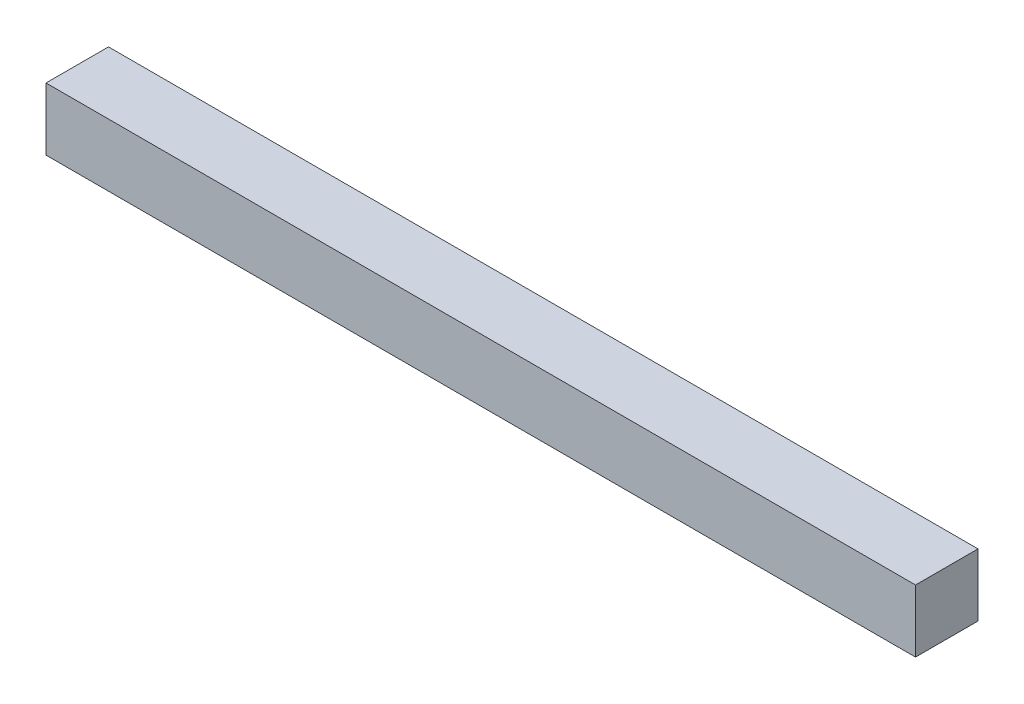
ISO-10303-21;
HEADER;
FILE_DESCRIPTION(('STEP AP214'),'2;1');
FILE_NAME('part.step','',(''),(''),'','','');
FILE_SCHEMA(('AUTOMOTIVE_DESIGN { 1 0 10303 214 1 1 1 1 }'));
ENDSEC;
DATA;
#1=APPLICATION_CONTEXT('core data for automotive mechanical design processes');
#2=APPLICATION_PROTOCOL_DEFINITION('international standard','automotive_design',2000,#1);
#3=PRODUCT_CONTEXT('',#1,'mechanical');
#4=PRODUCT('Part','Part','',(#3));
#5=PRODUCT_RELATED_PRODUCT_CATEGORY('part','',(#4));
#6=PRODUCT_DEFINITION_FORMATION('','',#4);
#7=PRODUCT_DEFINITION_CONTEXT('part definition',#1,'design');
#8=PRODUCT_DEFINITION('design','',#6,#7);
#9=PRODUCT_DEFINITION_SHAPE('','',#8);
#10=(LENGTH_UNIT() NAMED_UNIT(*) SI_UNIT(.MILLI.,.METRE.));
#11=(NAMED_UNIT(*) PLANE_ANGLE_UNIT() SI_UNIT($,.RADIAN.));
#12=(NAMED_UNIT(*) SI_UNIT($,.STERADIAN.) SOLID_ANGLE_UNIT());
#13=UNCERTAINTY_MEASURE_WITH_UNIT(LENGTH_MEASURE(1.E-05),#10,'distance_accuracy_value','');
#14=(GEOMETRIC_REPRESENTATION_CONTEXT(3) GLOBAL_UNCERTAINTY_ASSIGNED_CONTEXT((#13)) GLOBAL_UNIT_ASSIGNED_CONTEXT((#10,
#11,#12)) REPRESENTATION_CONTEXT('',''));
#15=CARTESIAN_POINT('',(0.,0.,0.));
#16=DIRECTION('',(0.,0.,1.));
#17=DIRECTION('',(1.,0.,0.));
#18=AXIS2_PLACEMENT_3D('',#15,#16,#17);
#19=CARTESIAN_POINT('',(320.,12.2375655490227,-5.62450341649455));
#20=DIRECTION('',(0.,0.,1.));
#21=DIRECTION('',(0.,-1.,0.));
#22=AXIS2_PLACEMENT_3D('',#19,#20,#21);
#23=PLANE('',#22);
#24=DIRECTION('',(0.,1.,0.));
#25=VECTOR('',#24,1.);
#26=CARTESIAN_POINT('',(0.,12.2375655490227,-5.62450341649455));
#27=LINE('',#26,#25);
#28=CARTESIAN_POINT('',(0.,-10.7624344509773,-5.62450341649455));
#29=VERTEX_POINT('',#28);
#30=CARTESIAN_POINT('',(0.,12.2375655490227,-5.62450341649455));
#31=VERTEX_POINT('',#30);
#32=EDGE_CURVE('E98',#29,#31,#27,.T.);
#33=ORIENTED_EDGE('',*,*,#32,.T.);
#34=DIRECTION('',(-1.,0.,0.));
#35=VECTOR('',#34,1.);
#36=CARTESIAN_POINT('',(320.,12.2375655490227,-5.62450341649455));
#37=LINE('',#36,#35);
#38=CARTESIAN_POINT('',(320.,12.2375655490227,-5.62450341649455));
#39=VERTEX_POINT('',#38);
#40=EDGE_CURVE('E11',#39,#31,#37,.T.);
#41=ORIENTED_EDGE('',*,*,#40,.F.);
#42=DIRECTION('',(0.,1.,0.));
#43=VECTOR('',#42,1.);
#44=CARTESIAN_POINT('',(320.,12.2375655490227,-5.62450341649455));
#45=LINE('',#44,#43);
#46=CARTESIAN_POINT('',(320.,-10.7624344509773,-5.62450341649455));
#47=VERTEX_POINT('',#46);
#48=EDGE_CURVE('E86',#47,#39,#45,.T.);
#49=ORIENTED_EDGE('',*,*,#48,.F.);
#50=DIRECTION('',(-1.,0.,0.));
#51=VECTOR('',#50,1.);
#52=CARTESIAN_POINT('',(320.,-10.7624344509773,-5.62450341649455));
#53=LINE('',#52,#51);
#54=EDGE_CURVE('E94',#47,#29,#53,.T.);
#55=ORIENTED_EDGE('',*,*,#54,.T.);
#56=EDGE_LOOP('',(#33,#41,#49,#55));
#57=FACE_BOUND('',#56,.T.);
#58=ADVANCED_FACE('F35',(#57),#23,.F.);
#59=CARTESIAN_POINT('',(320.,12.2375655490227,-5.62450341649455));
#60=DIRECTION('',(0.,-1.,0.));
#61=DIRECTION('',(0.,0.,-1.));
#62=AXIS2_PLACEMENT_3D('',#59,#60,#61);
#63=PLANE('',#62);
#64=DIRECTION('',(0.,0.,1.));
#65=VECTOR('',#64,1.);
#66=CARTESIAN_POINT('',(0.,12.2375655490227,-5.62450341649455));
#67=LINE('',#66,#65);
#68=CARTESIAN_POINT('',(0.,12.2375655490227,17.3754965835055));
#69=VERTEX_POINT('',#68);
#70=EDGE_CURVE('E90',#31,#69,#67,.T.);
#71=ORIENTED_EDGE('',*,*,#70,.T.);
#72=DIRECTION('',(-1.,0.,0.));
#73=VECTOR('',#72,1.);
#74=CARTESIAN_POINT('',(320.,12.2375655490227,17.3754965835055));
#75=LINE('',#74,#73);
#76=CARTESIAN_POINT('',(320.,12.2375655490227,17.3754965835055));
#77=VERTEX_POINT('',#76);
#78=EDGE_CURVE('E43',#77,#69,#75,.T.);
#79=ORIENTED_EDGE('',*,*,#78,.F.);
#80=DIRECTION('',(0.,0.,1.));
#81=VECTOR('',#80,1.);
#82=CARTESIAN_POINT('',(320.,12.2375655490227,-5.62450341649455));
#83=LINE('',#82,#81);
#84=EDGE_CURVE('E81',#39,#77,#83,.T.);
#85=ORIENTED_EDGE('',*,*,#84,.F.);
#86=ORIENTED_EDGE('',*,*,#40,.T.);
#87=EDGE_LOOP('',(#71,#79,#85,#86));
#88=FACE_BOUND('',#87,.T.);
#89=ADVANCED_FACE('F89',(#88),#63,.F.);
#90=CARTESIAN_POINT('',(320.,12.2375655490227,17.3754965835055));
#91=DIRECTION('',(0.,0.,-1.));
#92=DIRECTION('',(-1.,0.,0.));
#93=AXIS2_PLACEMENT_3D('',#90,#91,#92);
#94=PLANE('',#93);
#95=DIRECTION('',(0.,-1.,0.));
#96=VECTOR('',#95,1.);
#97=CARTESIAN_POINT('',(0.,12.2375655490227,17.3754965835055));
#98=LINE('',#97,#96);
#99=CARTESIAN_POINT('',(0.,-10.7624344509773,17.3754965835055));
#100=VERTEX_POINT('',#99);
#101=EDGE_CURVE('E68',#69,#100,#98,.T.);
#102=ORIENTED_EDGE('',*,*,#101,.T.);
#103=DIRECTION('',(-1.,0.,0.));
#104=VECTOR('',#103,1.);
#105=CARTESIAN_POINT('',(320.,-10.7624344509773,17.3754965835055));
#106=LINE('',#105,#104);
#107=CARTESIAN_POINT('',(320.,-10.7624344509773,17.3754965835055));
#108=VERTEX_POINT('',#107);
#109=EDGE_CURVE('E91',#108,#100,#106,.T.);
#110=ORIENTED_EDGE('',*,*,#109,.F.);
#111=DIRECTION('',(0.,-1.,0.));
#112=VECTOR('',#111,1.);
#113=CARTESIAN_POINT('',(320.,12.2375655490227,17.3754965835055));
#114=LINE('',#113,#112);
#115=EDGE_CURVE('E84',#77,#108,#114,.T.);
#116=ORIENTED_EDGE('',*,*,#115,.F.);
#117=ORIENTED_EDGE('',*,*,#78,.T.);
#118=EDGE_LOOP('',(#102,#110,#116,#117));
#119=FACE_BOUND('',#118,.T.);
#120=ADVANCED_FACE('F92',(#119),#94,.F.);
#121=CARTESIAN_POINT('',(320.,-10.7624344509773,-5.62450341649455));
#122=DIRECTION('',(0.,1.,0.));
#123=DIRECTION('',(0.,0.,1.));
#124=AXIS2_PLACEMENT_3D('',#121,#122,#123);
#125=PLANE('',#124);
#126=DIRECTION('',(0.,0.,-1.));
#127=VECTOR('',#126,1.);
#128=CARTESIAN_POINT('',(0.,-10.7624344509773,-5.62450341649455));
#129=LINE('',#128,#127);
#130=EDGE_CURVE('E74',#100,#29,#129,.T.);
#131=ORIENTED_EDGE('',*,*,#130,.T.);
#132=ORIENTED_EDGE('',*,*,#54,.F.);
#133=DIRECTION('',(0.,0.,-1.));
#134=VECTOR('',#133,1.);
#135=CARTESIAN_POINT('',(320.,-10.7624344509773,-5.62450341649455));
#136=LINE('',#135,#134);
#137=EDGE_CURVE('E51',#108,#47,#136,.T.);
#138=ORIENTED_EDGE('',*,*,#137,.F.);
#139=ORIENTED_EDGE('',*,*,#109,.T.);
#140=EDGE_LOOP('',(#131,#132,#138,#139));
#141=FACE_BOUND('',#140,.T.);
#142=ADVANCED_FACE('F105',(#141),#125,.F.);
#143=CARTESIAN_POINT('',(320.,0.,0.));
#144=DIRECTION('',(-1.,0.,0.));
#145=DIRECTION('',(0.,0.,1.));
#146=AXIS2_PLACEMENT_3D('',#143,#144,#145);
#147=PLANE('',#146);
#148=ORIENTED_EDGE('',*,*,#48,.T.);
#149=ORIENTED_EDGE('',*,*,#84,.T.);
#150=ORIENTED_EDGE('',*,*,#115,.T.);
#151=ORIENTED_EDGE('',*,*,#137,.T.);
#152=EDGE_LOOP('',(#148,#149,#150,#151));
#153=FACE_BOUND('',#152,.T.);
#154=ADVANCED_FACE('F82',(#153),#147,.F.);
#155=CARTESIAN_POINT('',(0.,0.,0.));
#156=DIRECTION('',(-1.,0.,0.));
#157=DIRECTION('',(0.,0.,1.));
#158=AXIS2_PLACEMENT_3D('',#155,#156,#157);
#159=PLANE('',#158);
#160=ORIENTED_EDGE('',*,*,#32,.F.);
#161=ORIENTED_EDGE('',*,*,#130,.F.);
#162=ORIENTED_EDGE('',*,*,#101,.F.);
#163=ORIENTED_EDGE('',*,*,#70,.F.);
#164=EDGE_LOOP('',(#160,#161,#162,#163));
#165=FACE_BOUND('',#164,.T.);
#166=ADVANCED_FACE('F108',(#165),#159,.T.);
#167=CLOSED_SHELL('',(#58,#89,#120,#142,#154,#166));
#168=MANIFOLD_SOLID_BREP('B2',#167);
#169=ADVANCED_BREP_SHAPE_REPRESENTATION('',(#18,#168),#14);
#170=SHAPE_DEFINITION_REPRESENTATION(#9,#169);
ENDSEC;
END-ISO-10303-21;
